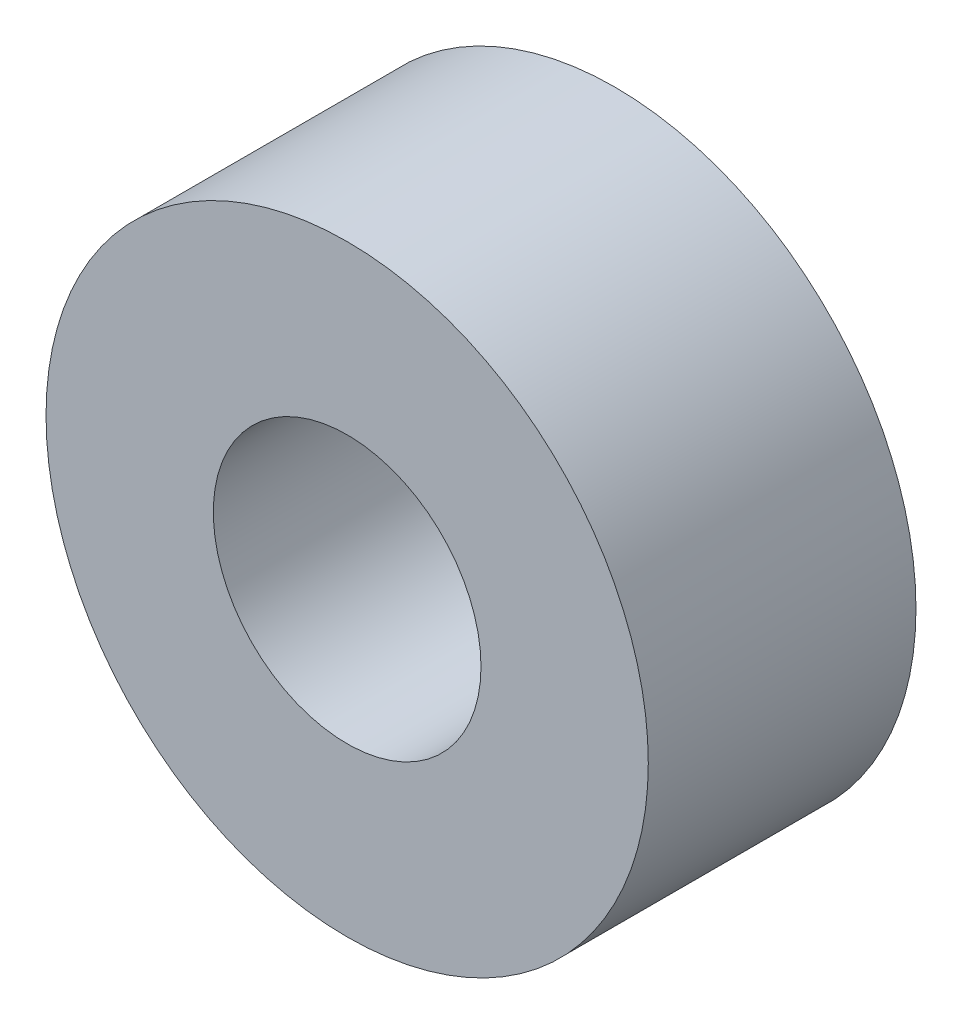
ISO-10303-21;
HEADER;
FILE_DESCRIPTION(('STEP AP214'),'2;1');
FILE_NAME('part.step','',(''),(''),'','','');
FILE_SCHEMA(('AUTOMOTIVE_DESIGN { 1 0 10303 214 1 1 1 1 }'));
ENDSEC;
DATA;
#1=APPLICATION_CONTEXT('core data for automotive mechanical design processes');
#2=APPLICATION_PROTOCOL_DEFINITION('international standard','automotive_design',2000,#1);
#3=PRODUCT_CONTEXT('',#1,'mechanical');
#4=PRODUCT('Part','Part','',(#3));
#5=PRODUCT_RELATED_PRODUCT_CATEGORY('part','',(#4));
#6=PRODUCT_DEFINITION_FORMATION('','',#4);
#7=PRODUCT_DEFINITION_CONTEXT('part definition',#1,'design');
#8=PRODUCT_DEFINITION('design','',#6,#7);
#9=PRODUCT_DEFINITION_SHAPE('','',#8);
#10=(LENGTH_UNIT() NAMED_UNIT(*) SI_UNIT(.MILLI.,.METRE.));
#11=(NAMED_UNIT(*) PLANE_ANGLE_UNIT() SI_UNIT($,.RADIAN.));
#12=(NAMED_UNIT(*) SI_UNIT($,.STERADIAN.) SOLID_ANGLE_UNIT());
#13=UNCERTAINTY_MEASURE_WITH_UNIT(LENGTH_MEASURE(1.E-05),#10,'distance_accuracy_value','');
#14=(GEOMETRIC_REPRESENTATION_CONTEXT(3) GLOBAL_UNCERTAINTY_ASSIGNED_CONTEXT((#13)) GLOBAL_UNIT_ASSIGNED_CONTEXT((#10,
#11,#12)) REPRESENTATION_CONTEXT('',''));
#15=CARTESIAN_POINT('',(0.,0.,0.));
#16=DIRECTION('',(0.,0.,1.));
#17=DIRECTION('',(1.,0.,0.));
#18=AXIS2_PLACEMENT_3D('',#15,#16,#17);
#19=CARTESIAN_POINT('',(0.,0.,4.));
#20=DIRECTION('',(0.,0.,1.));
#21=DIRECTION('',(1.,0.,0.));
#22=AXIS2_PLACEMENT_3D('',#19,#20,#21);
#23=PLANE('',#22);
#24=CARTESIAN_POINT('',(0.,0.,4.));
#25=DIRECTION('',(0.,0.,1.));
#26=DIRECTION('',(1.,0.,0.));
#27=AXIS2_PLACEMENT_3D('',#24,#25,#26);
#28=CIRCLE('',#27,4.5);
#29=CARTESIAN_POINT('',(4.5,0.,4.));
#30=VERTEX_POINT('',#29);
#31=EDGE_CURVE('E10',#30,#30,#28,.T.);
#32=ORIENTED_EDGE('',*,*,#31,.T.);
#33=EDGE_LOOP('',(#32));
#34=FACE_BOUND('',#33,.T.);
#35=CARTESIAN_POINT('',(0.,0.,4.));
#36=DIRECTION('',(0.,0.,1.));
#37=DIRECTION('',(1.,0.,0.));
#38=AXIS2_PLACEMENT_3D('',#35,#36,#37);
#39=CIRCLE('',#38,2.);
#40=CARTESIAN_POINT('',(2.,0.,4.));
#41=VERTEX_POINT('',#40);
#42=EDGE_CURVE('E50',#41,#41,#39,.T.);
#43=ORIENTED_EDGE('',*,*,#42,.F.);
#44=EDGE_LOOP('',(#43));
#45=FACE_BOUND('',#44,.T.);
#46=ADVANCED_FACE('F37',(#34,#45),#23,.T.);
#47=CARTESIAN_POINT('',(0.,0.,0.));
#48=DIRECTION('',(0.,0.,1.));
#49=DIRECTION('',(1.,0.,0.));
#50=AXIS2_PLACEMENT_3D('',#47,#48,#49);
#51=PLANE('',#50);
#52=CARTESIAN_POINT('',(0.,0.,0.));
#53=DIRECTION('',(0.,0.,1.));
#54=DIRECTION('',(1.,0.,0.));
#55=AXIS2_PLACEMENT_3D('',#52,#53,#54);
#56=CIRCLE('',#55,4.5);
#57=CARTESIAN_POINT('',(4.5,0.,0.));
#58=VERTEX_POINT('',#57);
#59=EDGE_CURVE('E41',#58,#58,#56,.T.);
#60=ORIENTED_EDGE('',*,*,#59,.F.);
#61=EDGE_LOOP('',(#60));
#62=FACE_BOUND('',#61,.T.);
#63=CARTESIAN_POINT('',(0.,0.,0.));
#64=DIRECTION('',(0.,0.,1.));
#65=DIRECTION('',(1.,0.,0.));
#66=AXIS2_PLACEMENT_3D('',#63,#64,#65);
#67=CIRCLE('',#66,2.);
#68=CARTESIAN_POINT('',(2.,0.,0.));
#69=VERTEX_POINT('',#68);
#70=EDGE_CURVE('E52',#69,#69,#67,.T.);
#71=ORIENTED_EDGE('',*,*,#70,.T.);
#72=EDGE_LOOP('',(#71));
#73=FACE_BOUND('',#72,.T.);
#74=ADVANCED_FACE('F64',(#62,#73),#51,.F.);
#75=CARTESIAN_POINT('',(0.,0.,4.));
#76=DIRECTION('',(0.,0.,-1.));
#77=DIRECTION('',(-1.,0.,0.));
#78=AXIS2_PLACEMENT_3D('',#75,#76,#77);
#79=CYLINDRICAL_SURFACE('',#78,4.5);
#80=ORIENTED_EDGE('',*,*,#31,.F.);
#81=EDGE_LOOP('',(#80));
#82=FACE_BOUND('',#81,.T.);
#83=ORIENTED_EDGE('',*,*,#59,.T.);
#84=EDGE_LOOP('',(#83));
#85=FACE_BOUND('',#84,.T.);
#86=ADVANCED_FACE('F39',(#82,#85),#79,.T.);
#87=CARTESIAN_POINT('',(0.,0.,4.));
#88=DIRECTION('',(0.,0.,-1.));
#89=DIRECTION('',(-1.,0.,0.));
#90=AXIS2_PLACEMENT_3D('',#87,#88,#89);
#91=CYLINDRICAL_SURFACE('',#90,2.);
#92=ORIENTED_EDGE('',*,*,#42,.T.);
#93=EDGE_LOOP('',(#92));
#94=FACE_BOUND('',#93,.T.);
#95=ORIENTED_EDGE('',*,*,#70,.F.);
#96=EDGE_LOOP('',(#95));
#97=FACE_BOUND('',#96,.T.);
#98=ADVANCED_FACE('F60',(#94,#97),#91,.F.);
#99=CLOSED_SHELL('',(#46,#74,#86,#98));
#100=MANIFOLD_SOLID_BREP('B2',#99);
#101=ADVANCED_BREP_SHAPE_REPRESENTATION('',(#18,#100),#14);
#102=SHAPE_DEFINITION_REPRESENTATION(#9,#101);
ENDSEC;
END-ISO-10303-21;
